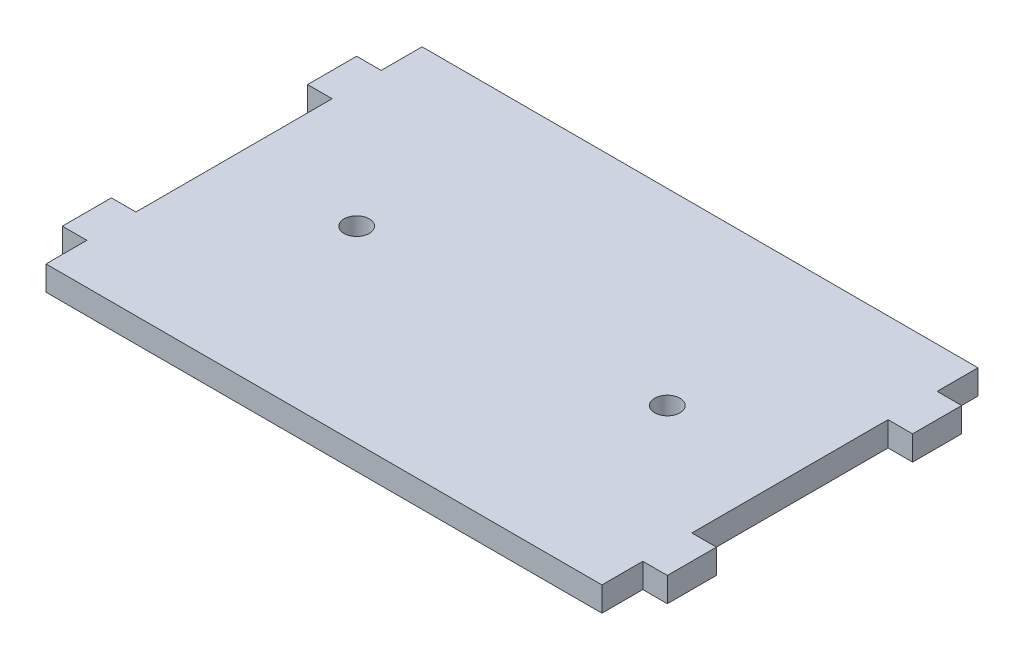
ISO-10303-21;
HEADER;
FILE_DESCRIPTION(('STEP AP214'),'2;1');
FILE_NAME('part.step','',(''),(''),'','','');
FILE_SCHEMA(('AUTOMOTIVE_DESIGN { 1 0 10303 214 1 1 1 1 }'));
ENDSEC;
DATA;
#1=APPLICATION_CONTEXT('core data for automotive mechanical design processes');
#2=APPLICATION_PROTOCOL_DEFINITION('international standard','automotive_design',2000,#1);
#3=PRODUCT_CONTEXT('',#1,'mechanical');
#4=PRODUCT('Part','Part','',(#3));
#5=PRODUCT_RELATED_PRODUCT_CATEGORY('part','',(#4));
#6=PRODUCT_DEFINITION_FORMATION('','',#4);
#7=PRODUCT_DEFINITION_CONTEXT('part definition',#1,'design');
#8=PRODUCT_DEFINITION('design','',#6,#7);
#9=PRODUCT_DEFINITION_SHAPE('','',#8);
#10=(LENGTH_UNIT() NAMED_UNIT(*) SI_UNIT(.MILLI.,.METRE.));
#11=(NAMED_UNIT(*) PLANE_ANGLE_UNIT() SI_UNIT($,.RADIAN.));
#12=(NAMED_UNIT(*) SI_UNIT($,.STERADIAN.) SOLID_ANGLE_UNIT());
#13=UNCERTAINTY_MEASURE_WITH_UNIT(LENGTH_MEASURE(1.E-05),#10,'distance_accuracy_value','');
#14=(GEOMETRIC_REPRESENTATION_CONTEXT(3) GLOBAL_UNCERTAINTY_ASSIGNED_CONTEXT((#13)) GLOBAL_UNIT_ASSIGNED_CONTEXT((#10,
#11,#12)) REPRESENTATION_CONTEXT('',''));
#15=CARTESIAN_POINT('',(0.,0.,0.));
#16=DIRECTION('',(0.,0.,1.));
#17=DIRECTION('',(1.,0.,0.));
#18=AXIS2_PLACEMENT_3D('',#15,#16,#17);
#19=CARTESIAN_POINT('',(0.,3.,0.));
#20=DIRECTION('',(0.,1.,0.));
#21=DIRECTION('',(0.,0.,1.));
#22=AXIS2_PLACEMENT_3D('',#19,#20,#21);
#23=PLANE('',#22);
#24=CARTESIAN_POINT('',(19.,3.,0.));
#25=DIRECTION('',(0.,1.,0.));
#26=DIRECTION('',(0.,0.,1.));
#27=AXIS2_PLACEMENT_3D('',#24,#25,#26);
#28=CIRCLE('',#27,1.55);
#29=CARTESIAN_POINT('',(19.,3.,1.55));
#30=VERTEX_POINT('',#29);
#31=EDGE_CURVE('E205',#30,#30,#28,.T.);
#32=ORIENTED_EDGE('',*,*,#31,.F.);
#33=EDGE_LOOP('',(#32));
#34=FACE_BOUND('',#33,.T.);
#35=DIRECTION('',(0.,0.,-1.));
#36=VECTOR('',#35,1.);
#37=CARTESIAN_POINT('',(34.,3.,-23.));
#38=LINE('',#37,#36);
#39=CARTESIAN_POINT('',(34.,3.,-18.));
#40=VERTEX_POINT('',#39);
#41=CARTESIAN_POINT('',(34.,3.,-23.));
#42=VERTEX_POINT('',#41);
#43=EDGE_CURVE('E240',#40,#42,#38,.T.);
#44=ORIENTED_EDGE('',*,*,#43,.T.);
#45=DIRECTION('',(-1.,0.,0.));
#46=VECTOR('',#45,1.);
#47=CARTESIAN_POINT('',(-34.,3.,-23.));
#48=LINE('',#47,#46);
#49=CARTESIAN_POINT('',(-34.,3.,-23.));
#50=VERTEX_POINT('',#49);
#51=EDGE_CURVE('E128',#42,#50,#48,.T.);
#52=ORIENTED_EDGE('',*,*,#51,.T.);
#53=DIRECTION('',(0.,0.,1.));
#54=VECTOR('',#53,1.);
#55=CARTESIAN_POINT('',(-34.,3.,-23.));
#56=LINE('',#55,#54);
#57=CARTESIAN_POINT('',(-34.,3.,-18.));
#58=VERTEX_POINT('',#57);
#59=EDGE_CURVE('E291',#50,#58,#56,.T.);
#60=ORIENTED_EDGE('',*,*,#59,.T.);
#61=DIRECTION('',(-1.,0.,0.));
#62=VECTOR('',#61,1.);
#63=CARTESIAN_POINT('',(-34.,3.,-18.));
#64=LINE('',#63,#62);
#65=CARTESIAN_POINT('',(-37.,3.,-18.));
#66=VERTEX_POINT('',#65);
#67=EDGE_CURVE('E310',#58,#66,#64,.T.);
#68=ORIENTED_EDGE('',*,*,#67,.T.);
#69=DIRECTION('',(0.,0.,1.));
#70=VECTOR('',#69,1.);
#71=CARTESIAN_POINT('',(-37.,3.,-18.));
#72=LINE('',#71,#70);
#73=CARTESIAN_POINT('',(-37.,3.,-12.));
#74=VERTEX_POINT('',#73);
#75=EDGE_CURVE('E307',#66,#74,#72,.T.);
#76=ORIENTED_EDGE('',*,*,#75,.T.);
#77=DIRECTION('',(1.,0.,0.));
#78=VECTOR('',#77,1.);
#79=CARTESIAN_POINT('',(-37.,3.,-12.));
#80=LINE('',#79,#78);
#81=CARTESIAN_POINT('',(-34.,3.,-12.));
#82=VERTEX_POINT('',#81);
#83=EDGE_CURVE('E309',#74,#82,#80,.T.);
#84=ORIENTED_EDGE('',*,*,#83,.T.);
#85=DIRECTION('',(0.,0.,1.));
#86=VECTOR('',#85,1.);
#87=CARTESIAN_POINT('',(-34.,3.,-12.));
#88=LINE('',#87,#86);
#89=CARTESIAN_POINT('',(-34.,3.,12.));
#90=VERTEX_POINT('',#89);
#91=EDGE_CURVE('E312',#82,#90,#88,.T.);
#92=ORIENTED_EDGE('',*,*,#91,.T.);
#93=DIRECTION('',(-1.,0.,0.));
#94=VECTOR('',#93,1.);
#95=CARTESIAN_POINT('',(-37.,3.,12.));
#96=LINE('',#95,#94);
#97=CARTESIAN_POINT('',(-37.,3.,12.));
#98=VERTEX_POINT('',#97);
#99=EDGE_CURVE('E318',#90,#98,#96,.T.);
#100=ORIENTED_EDGE('',*,*,#99,.T.);
#101=DIRECTION('',(0.,0.,1.));
#102=VECTOR('',#101,1.);
#103=CARTESIAN_POINT('',(-37.,3.,18.));
#104=LINE('',#103,#102);
#105=CARTESIAN_POINT('',(-37.,3.,18.));
#106=VERTEX_POINT('',#105);
#107=EDGE_CURVE('E320',#98,#106,#104,.T.);
#108=ORIENTED_EDGE('',*,*,#107,.T.);
#109=DIRECTION('',(1.,0.,0.));
#110=VECTOR('',#109,1.);
#111=CARTESIAN_POINT('',(-34.,3.,18.));
#112=LINE('',#111,#110);
#113=CARTESIAN_POINT('',(-34.,3.,18.));
#114=VERTEX_POINT('',#113);
#115=EDGE_CURVE('E322',#106,#114,#112,.T.);
#116=ORIENTED_EDGE('',*,*,#115,.T.);
#117=DIRECTION('',(0.,0.,1.));
#118=VECTOR('',#117,1.);
#119=CARTESIAN_POINT('',(-34.,3.,23.));
#120=LINE('',#119,#118);
#121=CARTESIAN_POINT('',(-34.,3.,23.));
#122=VERTEX_POINT('',#121);
#123=EDGE_CURVE('E324',#114,#122,#120,.T.);
#124=ORIENTED_EDGE('',*,*,#123,.T.);
#125=DIRECTION('',(1.,0.,0.));
#126=VECTOR('',#125,1.);
#127=CARTESIAN_POINT('',(-34.,3.,23.));
#128=LINE('',#127,#126);
#129=CARTESIAN_POINT('',(34.,3.,23.));
#130=VERTEX_POINT('',#129);
#131=EDGE_CURVE('E326',#122,#130,#128,.T.);
#132=ORIENTED_EDGE('',*,*,#131,.T.);
#133=DIRECTION('',(0.,0.,-1.));
#134=VECTOR('',#133,1.);
#135=CARTESIAN_POINT('',(34.,3.,23.));
#136=LINE('',#135,#134);
#137=CARTESIAN_POINT('',(34.,3.,18.));
#138=VERTEX_POINT('',#137);
#139=EDGE_CURVE('E328',#130,#138,#136,.T.);
#140=ORIENTED_EDGE('',*,*,#139,.T.);
#141=DIRECTION('',(1.,0.,0.));
#142=VECTOR('',#141,1.);
#143=CARTESIAN_POINT('',(34.,3.,18.));
#144=LINE('',#143,#142);
#145=CARTESIAN_POINT('',(37.,3.,18.));
#146=VERTEX_POINT('',#145);
#147=EDGE_CURVE('E330',#138,#146,#144,.T.);
#148=ORIENTED_EDGE('',*,*,#147,.T.);
#149=DIRECTION('',(0.,0.,-1.));
#150=VECTOR('',#149,1.);
#151=CARTESIAN_POINT('',(37.,3.,18.));
#152=LINE('',#151,#150);
#153=CARTESIAN_POINT('',(37.,3.,12.));
#154=VERTEX_POINT('',#153);
#155=EDGE_CURVE('E332',#146,#154,#152,.T.);
#156=ORIENTED_EDGE('',*,*,#155,.T.);
#157=DIRECTION('',(-1.,0.,0.));
#158=VECTOR('',#157,1.);
#159=CARTESIAN_POINT('',(37.,3.,12.));
#160=LINE('',#159,#158);
#161=CARTESIAN_POINT('',(34.,3.,12.));
#162=VERTEX_POINT('',#161);
#163=EDGE_CURVE('E334',#154,#162,#160,.T.);
#164=ORIENTED_EDGE('',*,*,#163,.T.);
#165=DIRECTION('',(0.,0.,-1.));
#166=VECTOR('',#165,1.);
#167=CARTESIAN_POINT('',(34.,3.,-12.));
#168=LINE('',#167,#166);
#169=CARTESIAN_POINT('',(34.,3.,-12.));
#170=VERTEX_POINT('',#169);
#171=EDGE_CURVE('E183',#162,#170,#168,.T.);
#172=ORIENTED_EDGE('',*,*,#171,.T.);
#173=DIRECTION('',(1.,0.,0.));
#174=VECTOR('',#173,1.);
#175=CARTESIAN_POINT('',(37.,3.,-12.));
#176=LINE('',#175,#174);
#177=CARTESIAN_POINT('',(37.,3.,-12.));
#178=VERTEX_POINT('',#177);
#179=EDGE_CURVE('E177',#170,#178,#176,.T.);
#180=ORIENTED_EDGE('',*,*,#179,.T.);
#181=DIRECTION('',(0.,0.,-1.));
#182=VECTOR('',#181,1.);
#183=CARTESIAN_POINT('',(37.,3.,-18.));
#184=LINE('',#183,#182);
#185=CARTESIAN_POINT('',(37.,3.,-18.));
#186=VERTEX_POINT('',#185);
#187=EDGE_CURVE('E181',#178,#186,#184,.T.);
#188=ORIENTED_EDGE('',*,*,#187,.T.);
#189=DIRECTION('',(-1.,0.,0.));
#190=VECTOR('',#189,1.);
#191=CARTESIAN_POINT('',(34.,3.,-18.));
#192=LINE('',#191,#190);
#193=EDGE_CURVE('E49',#186,#40,#192,.T.);
#194=ORIENTED_EDGE('',*,*,#193,.T.);
#195=EDGE_LOOP('',(#44,#52,#60,#68,#76,#84,#92,#100,#108,#116,#124,#132,#140,#148,#156,#164,
#172,#180,#188,#194));
#196=FACE_BOUND('',#195,.T.);
#197=CARTESIAN_POINT('',(-19.,3.,0.));
#198=DIRECTION('',(0.,1.,0.));
#199=DIRECTION('',(0.,0.,-1.));
#200=AXIS2_PLACEMENT_3D('',#197,#198,#199);
#201=CIRCLE('',#200,1.55);
#202=CARTESIAN_POINT('',(-19.,3.,-1.55));
#203=VERTEX_POINT('',#202);
#204=EDGE_CURVE('E376',#203,#203,#201,.T.);
#205=ORIENTED_EDGE('',*,*,#204,.F.);
#206=EDGE_LOOP('',(#205));
#207=FACE_BOUND('',#206,.T.);
#208=ADVANCED_FACE('F32',(#34,#196,#207),#23,.T.);
#209=CARTESIAN_POINT('',(0.,0.,0.));
#210=DIRECTION('',(0.,1.,0.));
#211=DIRECTION('',(0.,0.,1.));
#212=AXIS2_PLACEMENT_3D('',#209,#210,#211);
#213=PLANE('',#212);
#214=DIRECTION('',(0.,0.,-1.));
#215=VECTOR('',#214,1.);
#216=CARTESIAN_POINT('',(34.,0.,-23.));
#217=LINE('',#216,#215);
#218=CARTESIAN_POINT('',(34.,0.,-18.));
#219=VERTEX_POINT('',#218);
#220=CARTESIAN_POINT('',(34.,0.,-23.));
#221=VERTEX_POINT('',#220);
#222=EDGE_CURVE('E201',#219,#221,#217,.T.);
#223=ORIENTED_EDGE('',*,*,#222,.F.);
#224=DIRECTION('',(-1.,0.,0.));
#225=VECTOR('',#224,1.);
#226=CARTESIAN_POINT('',(34.,0.,-18.));
#227=LINE('',#226,#225);
#228=CARTESIAN_POINT('',(37.,0.,-18.));
#229=VERTEX_POINT('',#228);
#230=EDGE_CURVE('E120',#229,#219,#227,.T.);
#231=ORIENTED_EDGE('',*,*,#230,.F.);
#232=DIRECTION('',(0.,0.,-1.));
#233=VECTOR('',#232,1.);
#234=CARTESIAN_POINT('',(37.,0.,-18.));
#235=LINE('',#234,#233);
#236=CARTESIAN_POINT('',(37.,0.,-12.));
#237=VERTEX_POINT('',#236);
#238=EDGE_CURVE('E114',#237,#229,#235,.T.);
#239=ORIENTED_EDGE('',*,*,#238,.F.);
#240=DIRECTION('',(1.,0.,0.));
#241=VECTOR('',#240,1.);
#242=CARTESIAN_POINT('',(37.,0.,-12.));
#243=LINE('',#242,#241);
#244=CARTESIAN_POINT('',(34.,0.,-12.));
#245=VERTEX_POINT('',#244);
#246=EDGE_CURVE('E191',#245,#237,#243,.T.);
#247=ORIENTED_EDGE('',*,*,#246,.F.);
#248=DIRECTION('',(0.,0.,-1.));
#249=VECTOR('',#248,1.);
#250=CARTESIAN_POINT('',(34.,0.,-12.));
#251=LINE('',#250,#249);
#252=CARTESIAN_POINT('',(34.,0.,12.));
#253=VERTEX_POINT('',#252);
#254=EDGE_CURVE('E235',#253,#245,#251,.T.);
#255=ORIENTED_EDGE('',*,*,#254,.F.);
#256=DIRECTION('',(-1.,0.,0.));
#257=VECTOR('',#256,1.);
#258=CARTESIAN_POINT('',(37.,0.,12.));
#259=LINE('',#258,#257);
#260=CARTESIAN_POINT('',(37.,0.,12.));
#261=VERTEX_POINT('',#260);
#262=EDGE_CURVE('E233',#261,#253,#259,.T.);
#263=ORIENTED_EDGE('',*,*,#262,.F.);
#264=DIRECTION('',(0.,0.,-1.));
#265=VECTOR('',#264,1.);
#266=CARTESIAN_POINT('',(37.,0.,18.));
#267=LINE('',#266,#265);
#268=CARTESIAN_POINT('',(37.,0.,18.));
#269=VERTEX_POINT('',#268);
#270=EDGE_CURVE('E231',#269,#261,#267,.T.);
#271=ORIENTED_EDGE('',*,*,#270,.F.);
#272=DIRECTION('',(1.,0.,0.));
#273=VECTOR('',#272,1.);
#274=CARTESIAN_POINT('',(34.,0.,18.));
#275=LINE('',#274,#273);
#276=CARTESIAN_POINT('',(34.,0.,18.));
#277=VERTEX_POINT('',#276);
#278=EDGE_CURVE('E229',#277,#269,#275,.T.);
#279=ORIENTED_EDGE('',*,*,#278,.F.);
#280=DIRECTION('',(0.,0.,-1.));
#281=VECTOR('',#280,1.);
#282=CARTESIAN_POINT('',(34.,0.,23.));
#283=LINE('',#282,#281);
#284=CARTESIAN_POINT('',(34.,0.,23.));
#285=VERTEX_POINT('',#284);
#286=EDGE_CURVE('E227',#285,#277,#283,.T.);
#287=ORIENTED_EDGE('',*,*,#286,.F.);
#288=DIRECTION('',(1.,0.,0.));
#289=VECTOR('',#288,1.);
#290=CARTESIAN_POINT('',(-34.,0.,23.));
#291=LINE('',#290,#289);
#292=CARTESIAN_POINT('',(-34.,0.,23.));
#293=VERTEX_POINT('',#292);
#294=EDGE_CURVE('E225',#293,#285,#291,.T.);
#295=ORIENTED_EDGE('',*,*,#294,.F.);
#296=DIRECTION('',(0.,0.,1.));
#297=VECTOR('',#296,1.);
#298=CARTESIAN_POINT('',(-34.,0.,23.));
#299=LINE('',#298,#297);
#300=CARTESIAN_POINT('',(-34.,0.,18.));
#301=VERTEX_POINT('',#300);
#302=EDGE_CURVE('E223',#301,#293,#299,.T.);
#303=ORIENTED_EDGE('',*,*,#302,.F.);
#304=DIRECTION('',(1.,0.,0.));
#305=VECTOR('',#304,1.);
#306=CARTESIAN_POINT('',(-34.,0.,18.));
#307=LINE('',#306,#305);
#308=CARTESIAN_POINT('',(-37.,0.,18.));
#309=VERTEX_POINT('',#308);
#310=EDGE_CURVE('E221',#309,#301,#307,.T.);
#311=ORIENTED_EDGE('',*,*,#310,.F.);
#312=DIRECTION('',(0.,0.,1.));
#313=VECTOR('',#312,1.);
#314=CARTESIAN_POINT('',(-37.,0.,18.));
#315=LINE('',#314,#313);
#316=CARTESIAN_POINT('',(-37.,0.,12.));
#317=VERTEX_POINT('',#316);
#318=EDGE_CURVE('E219',#317,#309,#315,.T.);
#319=ORIENTED_EDGE('',*,*,#318,.F.);
#320=DIRECTION('',(-1.,0.,0.));
#321=VECTOR('',#320,1.);
#322=CARTESIAN_POINT('',(-37.,0.,12.));
#323=LINE('',#322,#321);
#324=CARTESIAN_POINT('',(-34.,0.,12.));
#325=VERTEX_POINT('',#324);
#326=EDGE_CURVE('E217',#325,#317,#323,.T.);
#327=ORIENTED_EDGE('',*,*,#326,.F.);
#328=DIRECTION('',(0.,0.,1.));
#329=VECTOR('',#328,1.);
#330=CARTESIAN_POINT('',(-34.,0.,-12.));
#331=LINE('',#330,#329);
#332=CARTESIAN_POINT('',(-34.,0.,-12.));
#333=VERTEX_POINT('',#332);
#334=EDGE_CURVE('E215',#333,#325,#331,.T.);
#335=ORIENTED_EDGE('',*,*,#334,.F.);
#336=DIRECTION('',(1.,0.,0.));
#337=VECTOR('',#336,1.);
#338=CARTESIAN_POINT('',(-37.,0.,-12.));
#339=LINE('',#338,#337);
#340=CARTESIAN_POINT('',(-37.,0.,-12.));
#341=VERTEX_POINT('',#340);
#342=EDGE_CURVE('E213',#341,#333,#339,.T.);
#343=ORIENTED_EDGE('',*,*,#342,.F.);
#344=DIRECTION('',(0.,0.,1.));
#345=VECTOR('',#344,1.);
#346=CARTESIAN_POINT('',(-37.,0.,-18.));
#347=LINE('',#346,#345);
#348=CARTESIAN_POINT('',(-37.,0.,-18.));
#349=VERTEX_POINT('',#348);
#350=EDGE_CURVE('E211',#349,#341,#347,.T.);
#351=ORIENTED_EDGE('',*,*,#350,.F.);
#352=DIRECTION('',(-1.,0.,0.));
#353=VECTOR('',#352,1.);
#354=CARTESIAN_POINT('',(-34.,0.,-18.));
#355=LINE('',#354,#353);
#356=CARTESIAN_POINT('',(-34.,0.,-18.));
#357=VERTEX_POINT('',#356);
#358=EDGE_CURVE('E209',#357,#349,#355,.T.);
#359=ORIENTED_EDGE('',*,*,#358,.F.);
#360=DIRECTION('',(0.,0.,1.));
#361=VECTOR('',#360,1.);
#362=CARTESIAN_POINT('',(-34.,0.,-23.));
#363=LINE('',#362,#361);
#364=CARTESIAN_POINT('',(-34.,0.,-23.));
#365=VERTEX_POINT('',#364);
#366=EDGE_CURVE('E207',#365,#357,#363,.T.);
#367=ORIENTED_EDGE('',*,*,#366,.F.);
#368=DIRECTION('',(-1.,0.,0.));
#369=VECTOR('',#368,1.);
#370=CARTESIAN_POINT('',(-34.,0.,-23.));
#371=LINE('',#370,#369);
#372=EDGE_CURVE('E204',#221,#365,#371,.T.);
#373=ORIENTED_EDGE('',*,*,#372,.F.);
#374=EDGE_LOOP('',(#223,#231,#239,#247,#255,#263,#271,#279,#287,#295,#303,#311,#319,#327,#335,
#343,#351,#359,#367,#373));
#375=FACE_BOUND('',#374,.T.);
#376=CARTESIAN_POINT('',(19.,0.,0.));
#377=DIRECTION('',(0.,1.,0.));
#378=DIRECTION('',(0.,0.,1.));
#379=AXIS2_PLACEMENT_3D('',#376,#377,#378);
#380=CIRCLE('',#379,1.55);
#381=CARTESIAN_POINT('',(19.,0.,1.55));
#382=VERTEX_POINT('',#381);
#383=EDGE_CURVE('E382',#382,#382,#380,.T.);
#384=ORIENTED_EDGE('',*,*,#383,.T.);
#385=EDGE_LOOP('',(#384));
#386=FACE_BOUND('',#385,.T.);
#387=CARTESIAN_POINT('',(-19.,0.,0.));
#388=DIRECTION('',(0.,1.,0.));
#389=DIRECTION('',(0.,0.,-1.));
#390=AXIS2_PLACEMENT_3D('',#387,#388,#389);
#391=CIRCLE('',#390,1.55);
#392=CARTESIAN_POINT('',(-19.,0.,-1.55));
#393=VERTEX_POINT('',#392);
#394=EDGE_CURVE('E379',#393,#393,#391,.T.);
#395=ORIENTED_EDGE('',*,*,#394,.T.);
#396=EDGE_LOOP('',(#395));
#397=FACE_BOUND('',#396,.T.);
#398=ADVANCED_FACE('F295',(#375,#386,#397),#213,.F.);
#399=CARTESIAN_POINT('',(34.,3.,-23.));
#400=DIRECTION('',(-1.,0.,0.));
#401=DIRECTION('',(0.,0.,1.));
#402=AXIS2_PLACEMENT_3D('',#399,#400,#401);
#403=PLANE('',#402);
#404=ORIENTED_EDGE('',*,*,#222,.T.);
#405=DIRECTION('',(0.,-1.,0.));
#406=VECTOR('',#405,1.);
#407=CARTESIAN_POINT('',(34.,3.,-23.));
#408=LINE('',#407,#406);
#409=EDGE_CURVE('E11',#42,#221,#408,.T.);
#410=ORIENTED_EDGE('',*,*,#409,.F.);
#411=ORIENTED_EDGE('',*,*,#43,.F.);
#412=DIRECTION('',(0.,-1.,0.));
#413=VECTOR('',#412,1.);
#414=CARTESIAN_POINT('',(34.,3.,-18.));
#415=LINE('',#414,#413);
#416=EDGE_CURVE('E197',#40,#219,#415,.T.);
#417=ORIENTED_EDGE('',*,*,#416,.T.);
#418=EDGE_LOOP('',(#404,#410,#411,#417));
#419=FACE_BOUND('',#418,.T.);
#420=ADVANCED_FACE('F34',(#419),#403,.F.);
#421=CARTESIAN_POINT('',(-34.,3.,-23.));
#422=DIRECTION('',(0.,0.,1.));
#423=DIRECTION('',(1.,0.,0.));
#424=AXIS2_PLACEMENT_3D('',#421,#422,#423);
#425=PLANE('',#424);
#426=ORIENTED_EDGE('',*,*,#372,.T.);
#427=DIRECTION('',(0.,-1.,0.));
#428=VECTOR('',#427,1.);
#429=CARTESIAN_POINT('',(-34.,3.,-23.));
#430=LINE('',#429,#428);
#431=EDGE_CURVE('E41',#50,#365,#430,.T.);
#432=ORIENTED_EDGE('',*,*,#431,.F.);
#433=ORIENTED_EDGE('',*,*,#51,.F.);
#434=ORIENTED_EDGE('',*,*,#409,.T.);
#435=EDGE_LOOP('',(#426,#432,#433,#434));
#436=FACE_BOUND('',#435,.T.);
#437=ADVANCED_FACE('F555',(#436),#425,.F.);
#438=CARTESIAN_POINT('',(-34.,3.,-23.));
#439=DIRECTION('',(1.,0.,0.));
#440=DIRECTION('',(0.,0.,-1.));
#441=AXIS2_PLACEMENT_3D('',#438,#439,#440);
#442=PLANE('',#441);
#443=ORIENTED_EDGE('',*,*,#366,.T.);
#444=DIRECTION('',(0.,-1.,0.));
#445=VECTOR('',#444,1.);
#446=CARTESIAN_POINT('',(-34.,3.,-18.));
#447=LINE('',#446,#445);
#448=EDGE_CURVE('E283',#58,#357,#447,.T.);
#449=ORIENTED_EDGE('',*,*,#448,.F.);
#450=ORIENTED_EDGE('',*,*,#59,.F.);
#451=ORIENTED_EDGE('',*,*,#431,.T.);
#452=EDGE_LOOP('',(#443,#449,#450,#451));
#453=FACE_BOUND('',#452,.T.);
#454=ADVANCED_FACE('F289',(#453),#442,.F.);
#455=CARTESIAN_POINT('',(-34.,3.,-18.));
#456=DIRECTION('',(0.,0.,1.));
#457=DIRECTION('',(1.,0.,0.));
#458=AXIS2_PLACEMENT_3D('',#455,#456,#457);
#459=PLANE('',#458);
#460=ORIENTED_EDGE('',*,*,#358,.T.);
#461=DIRECTION('',(0.,-1.,0.));
#462=VECTOR('',#461,1.);
#463=CARTESIAN_POINT('',(-37.,3.,-18.));
#464=LINE('',#463,#462);
#465=EDGE_CURVE('E280',#66,#349,#464,.T.);
#466=ORIENTED_EDGE('',*,*,#465,.F.);
#467=ORIENTED_EDGE('',*,*,#67,.F.);
#468=ORIENTED_EDGE('',*,*,#448,.T.);
#469=EDGE_LOOP('',(#460,#466,#467,#468));
#470=FACE_BOUND('',#469,.T.);
#471=ADVANCED_FACE('F301',(#470),#459,.F.);
#472=CARTESIAN_POINT('',(-37.,3.,-18.));
#473=DIRECTION('',(1.,0.,0.));
#474=DIRECTION('',(0.,0.,-1.));
#475=AXIS2_PLACEMENT_3D('',#472,#473,#474);
#476=PLANE('',#475);
#477=ORIENTED_EDGE('',*,*,#350,.T.);
#478=DIRECTION('',(0.,-1.,0.));
#479=VECTOR('',#478,1.);
#480=CARTESIAN_POINT('',(-37.,3.,-12.));
#481=LINE('',#480,#479);
#482=EDGE_CURVE('E277',#74,#341,#481,.T.);
#483=ORIENTED_EDGE('',*,*,#482,.F.);
#484=ORIENTED_EDGE('',*,*,#75,.F.);
#485=ORIENTED_EDGE('',*,*,#465,.T.);
#486=EDGE_LOOP('',(#477,#483,#484,#485));
#487=FACE_BOUND('',#486,.T.);
#488=ADVANCED_FACE('F305',(#487),#476,.F.);
#489=CARTESIAN_POINT('',(-37.,3.,-12.));
#490=DIRECTION('',(0.,0.,-1.));
#491=DIRECTION('',(-1.,0.,0.));
#492=AXIS2_PLACEMENT_3D('',#489,#490,#491);
#493=PLANE('',#492);
#494=ORIENTED_EDGE('',*,*,#342,.T.);
#495=DIRECTION('',(0.,-1.,0.));
#496=VECTOR('',#495,1.);
#497=CARTESIAN_POINT('',(-34.,3.,-12.));
#498=LINE('',#497,#496);
#499=EDGE_CURVE('E274',#82,#333,#498,.T.);
#500=ORIENTED_EDGE('',*,*,#499,.F.);
#501=ORIENTED_EDGE('',*,*,#83,.F.);
#502=ORIENTED_EDGE('',*,*,#482,.T.);
#503=EDGE_LOOP('',(#494,#500,#501,#502));
#504=FACE_BOUND('',#503,.T.);
#505=ADVANCED_FACE('F520',(#504),#493,.F.);
#506=CARTESIAN_POINT('',(-34.,3.,-12.));
#507=DIRECTION('',(1.,0.,0.));
#508=DIRECTION('',(0.,0.,-1.));
#509=AXIS2_PLACEMENT_3D('',#506,#507,#508);
#510=PLANE('',#509);
#511=ORIENTED_EDGE('',*,*,#334,.T.);
#512=DIRECTION('',(0.,-1.,0.));
#513=VECTOR('',#512,1.);
#514=CARTESIAN_POINT('',(-34.,3.,12.));
#515=LINE('',#514,#513);
#516=EDGE_CURVE('E271',#90,#325,#515,.T.);
#517=ORIENTED_EDGE('',*,*,#516,.F.);
#518=ORIENTED_EDGE('',*,*,#91,.F.);
#519=ORIENTED_EDGE('',*,*,#499,.T.);
#520=EDGE_LOOP('',(#511,#517,#518,#519));
#521=FACE_BOUND('',#520,.T.);
#522=ADVANCED_FACE('F510',(#521),#510,.F.);
#523=CARTESIAN_POINT('',(-37.,3.,12.));
#524=DIRECTION('',(0.,0.,1.));
#525=DIRECTION('',(1.,0.,0.));
#526=AXIS2_PLACEMENT_3D('',#523,#524,#525);
#527=PLANE('',#526);
#528=ORIENTED_EDGE('',*,*,#326,.T.);
#529=DIRECTION('',(0.,-1.,0.));
#530=VECTOR('',#529,1.);
#531=CARTESIAN_POINT('',(-37.,3.,12.));
#532=LINE('',#531,#530);
#533=EDGE_CURVE('E268',#98,#317,#532,.T.);
#534=ORIENTED_EDGE('',*,*,#533,.F.);
#535=ORIENTED_EDGE('',*,*,#99,.F.);
#536=ORIENTED_EDGE('',*,*,#516,.T.);
#537=EDGE_LOOP('',(#528,#534,#535,#536));
#538=FACE_BOUND('',#537,.T.);
#539=ADVANCED_FACE('F500',(#538),#527,.F.);
#540=CARTESIAN_POINT('',(-37.,3.,18.));
#541=DIRECTION('',(1.,0.,0.));
#542=DIRECTION('',(0.,0.,-1.));
#543=AXIS2_PLACEMENT_3D('',#540,#541,#542);
#544=PLANE('',#543);
#545=ORIENTED_EDGE('',*,*,#318,.T.);
#546=DIRECTION('',(0.,-1.,0.));
#547=VECTOR('',#546,1.);
#548=CARTESIAN_POINT('',(-37.,3.,18.));
#549=LINE('',#548,#547);
#550=EDGE_CURVE('E265',#106,#309,#549,.T.);
#551=ORIENTED_EDGE('',*,*,#550,.F.);
#552=ORIENTED_EDGE('',*,*,#107,.F.);
#553=ORIENTED_EDGE('',*,*,#533,.T.);
#554=EDGE_LOOP('',(#545,#551,#552,#553));
#555=FACE_BOUND('',#554,.T.);
#556=ADVANCED_FACE('F490',(#555),#544,.F.);
#557=CARTESIAN_POINT('',(-34.,3.,18.));
#558=DIRECTION('',(0.,0.,-1.));
#559=DIRECTION('',(-1.,0.,0.));
#560=AXIS2_PLACEMENT_3D('',#557,#558,#559);
#561=PLANE('',#560);
#562=ORIENTED_EDGE('',*,*,#310,.T.);
#563=DIRECTION('',(0.,-1.,0.));
#564=VECTOR('',#563,1.);
#565=CARTESIAN_POINT('',(-34.,3.,18.));
#566=LINE('',#565,#564);
#567=EDGE_CURVE('E262',#114,#301,#566,.T.);
#568=ORIENTED_EDGE('',*,*,#567,.F.);
#569=ORIENTED_EDGE('',*,*,#115,.F.);
#570=ORIENTED_EDGE('',*,*,#550,.T.);
#571=EDGE_LOOP('',(#562,#568,#569,#570));
#572=FACE_BOUND('',#571,.T.);
#573=ADVANCED_FACE('F480',(#572),#561,.F.);
#574=CARTESIAN_POINT('',(-34.,3.,23.));
#575=DIRECTION('',(1.,0.,0.));
#576=DIRECTION('',(0.,0.,-1.));
#577=AXIS2_PLACEMENT_3D('',#574,#575,#576);
#578=PLANE('',#577);
#579=ORIENTED_EDGE('',*,*,#302,.T.);
#580=DIRECTION('',(0.,-1.,0.));
#581=VECTOR('',#580,1.);
#582=CARTESIAN_POINT('',(-34.,3.,23.));
#583=LINE('',#582,#581);
#584=EDGE_CURVE('E259',#122,#293,#583,.T.);
#585=ORIENTED_EDGE('',*,*,#584,.F.);
#586=ORIENTED_EDGE('',*,*,#123,.F.);
#587=ORIENTED_EDGE('',*,*,#567,.T.);
#588=EDGE_LOOP('',(#579,#585,#586,#587));
#589=FACE_BOUND('',#588,.T.);
#590=ADVANCED_FACE('F470',(#589),#578,.F.);
#591=CARTESIAN_POINT('',(-34.,3.,23.));
#592=DIRECTION('',(0.,0.,-1.));
#593=DIRECTION('',(-1.,0.,0.));
#594=AXIS2_PLACEMENT_3D('',#591,#592,#593);
#595=PLANE('',#594);
#596=ORIENTED_EDGE('',*,*,#294,.T.);
#597=DIRECTION('',(0.,-1.,0.));
#598=VECTOR('',#597,1.);
#599=CARTESIAN_POINT('',(34.,3.,23.));
#600=LINE('',#599,#598);
#601=EDGE_CURVE('E256',#130,#285,#600,.T.);
#602=ORIENTED_EDGE('',*,*,#601,.F.);
#603=ORIENTED_EDGE('',*,*,#131,.F.);
#604=ORIENTED_EDGE('',*,*,#584,.T.);
#605=EDGE_LOOP('',(#596,#602,#603,#604));
#606=FACE_BOUND('',#605,.T.);
#607=ADVANCED_FACE('F460',(#606),#595,.F.);
#608=CARTESIAN_POINT('',(34.,3.,23.));
#609=DIRECTION('',(-1.,0.,0.));
#610=DIRECTION('',(0.,0.,1.));
#611=AXIS2_PLACEMENT_3D('',#608,#609,#610);
#612=PLANE('',#611);
#613=ORIENTED_EDGE('',*,*,#286,.T.);
#614=DIRECTION('',(0.,-1.,0.));
#615=VECTOR('',#614,1.);
#616=CARTESIAN_POINT('',(34.,3.,18.));
#617=LINE('',#616,#615);
#618=EDGE_CURVE('E253',#138,#277,#617,.T.);
#619=ORIENTED_EDGE('',*,*,#618,.F.);
#620=ORIENTED_EDGE('',*,*,#139,.F.);
#621=ORIENTED_EDGE('',*,*,#601,.T.);
#622=EDGE_LOOP('',(#613,#619,#620,#621));
#623=FACE_BOUND('',#622,.T.);
#624=ADVANCED_FACE('F450',(#623),#612,.F.);
#625=CARTESIAN_POINT('',(34.,3.,18.));
#626=DIRECTION('',(0.,0.,-1.));
#627=DIRECTION('',(-1.,0.,0.));
#628=AXIS2_PLACEMENT_3D('',#625,#626,#627);
#629=PLANE('',#628);
#630=ORIENTED_EDGE('',*,*,#278,.T.);
#631=DIRECTION('',(0.,-1.,0.));
#632=VECTOR('',#631,1.);
#633=CARTESIAN_POINT('',(37.,3.,18.));
#634=LINE('',#633,#632);
#635=EDGE_CURVE('E250',#146,#269,#634,.T.);
#636=ORIENTED_EDGE('',*,*,#635,.F.);
#637=ORIENTED_EDGE('',*,*,#147,.F.);
#638=ORIENTED_EDGE('',*,*,#618,.T.);
#639=EDGE_LOOP('',(#630,#636,#637,#638));
#640=FACE_BOUND('',#639,.T.);
#641=ADVANCED_FACE('F440',(#640),#629,.F.);
#642=CARTESIAN_POINT('',(37.,3.,18.));
#643=DIRECTION('',(-1.,0.,0.));
#644=DIRECTION('',(0.,0.,1.));
#645=AXIS2_PLACEMENT_3D('',#642,#643,#644);
#646=PLANE('',#645);
#647=ORIENTED_EDGE('',*,*,#270,.T.);
#648=DIRECTION('',(0.,-1.,0.));
#649=VECTOR('',#648,1.);
#650=CARTESIAN_POINT('',(37.,3.,12.));
#651=LINE('',#650,#649);
#652=EDGE_CURVE('E247',#154,#261,#651,.T.);
#653=ORIENTED_EDGE('',*,*,#652,.F.);
#654=ORIENTED_EDGE('',*,*,#155,.F.);
#655=ORIENTED_EDGE('',*,*,#635,.T.);
#656=EDGE_LOOP('',(#647,#653,#654,#655));
#657=FACE_BOUND('',#656,.T.);
#658=ADVANCED_FACE('F431',(#657),#646,.F.);
#659=CARTESIAN_POINT('',(37.,3.,12.));
#660=DIRECTION('',(0.,0.,1.));
#661=DIRECTION('',(1.,0.,0.));
#662=AXIS2_PLACEMENT_3D('',#659,#660,#661);
#663=PLANE('',#662);
#664=ORIENTED_EDGE('',*,*,#262,.T.);
#665=DIRECTION('',(0.,-1.,0.));
#666=VECTOR('',#665,1.);
#667=CARTESIAN_POINT('',(34.,3.,12.));
#668=LINE('',#667,#666);
#669=EDGE_CURVE('E244',#162,#253,#668,.T.);
#670=ORIENTED_EDGE('',*,*,#669,.F.);
#671=ORIENTED_EDGE('',*,*,#163,.F.);
#672=ORIENTED_EDGE('',*,*,#652,.T.);
#673=EDGE_LOOP('',(#664,#670,#671,#672));
#674=FACE_BOUND('',#673,.T.);
#675=ADVANCED_FACE('F340',(#674),#663,.F.);
#676=CARTESIAN_POINT('',(34.,3.,-12.));
#677=DIRECTION('',(-1.,0.,0.));
#678=DIRECTION('',(0.,0.,1.));
#679=AXIS2_PLACEMENT_3D('',#676,#677,#678);
#680=PLANE('',#679);
#681=ORIENTED_EDGE('',*,*,#254,.T.);
#682=DIRECTION('',(0.,-1.,0.));
#683=VECTOR('',#682,1.);
#684=CARTESIAN_POINT('',(34.,3.,-12.));
#685=LINE('',#684,#683);
#686=EDGE_CURVE('E192',#170,#245,#685,.T.);
#687=ORIENTED_EDGE('',*,*,#686,.F.);
#688=ORIENTED_EDGE('',*,*,#171,.F.);
#689=ORIENTED_EDGE('',*,*,#669,.T.);
#690=EDGE_LOOP('',(#681,#687,#688,#689));
#691=FACE_BOUND('',#690,.T.);
#692=ADVANCED_FACE('F344',(#691),#680,.F.);
#693=CARTESIAN_POINT('',(37.,3.,-12.));
#694=DIRECTION('',(0.,0.,-1.));
#695=DIRECTION('',(-1.,0.,0.));
#696=AXIS2_PLACEMENT_3D('',#693,#694,#695);
#697=PLANE('',#696);
#698=ORIENTED_EDGE('',*,*,#246,.T.);
#699=DIRECTION('',(0.,-1.,0.));
#700=VECTOR('',#699,1.);
#701=CARTESIAN_POINT('',(37.,3.,-12.));
#702=LINE('',#701,#700);
#703=EDGE_CURVE('E188',#178,#237,#702,.T.);
#704=ORIENTED_EDGE('',*,*,#703,.F.);
#705=ORIENTED_EDGE('',*,*,#179,.F.);
#706=ORIENTED_EDGE('',*,*,#686,.T.);
#707=EDGE_LOOP('',(#698,#704,#705,#706));
#708=FACE_BOUND('',#707,.T.);
#709=ADVANCED_FACE('F189',(#708),#697,.F.);
#710=CARTESIAN_POINT('',(37.,3.,-18.));
#711=DIRECTION('',(-1.,0.,0.));
#712=DIRECTION('',(0.,0.,1.));
#713=AXIS2_PLACEMENT_3D('',#710,#711,#712);
#714=PLANE('',#713);
#715=ORIENTED_EDGE('',*,*,#238,.T.);
#716=DIRECTION('',(0.,-1.,0.));
#717=VECTOR('',#716,1.);
#718=CARTESIAN_POINT('',(37.,3.,-18.));
#719=LINE('',#718,#717);
#720=EDGE_CURVE('E193',#186,#229,#719,.T.);
#721=ORIENTED_EDGE('',*,*,#720,.F.);
#722=ORIENTED_EDGE('',*,*,#187,.F.);
#723=ORIENTED_EDGE('',*,*,#703,.T.);
#724=EDGE_LOOP('',(#715,#721,#722,#723));
#725=FACE_BOUND('',#724,.T.);
#726=ADVANCED_FACE('F195',(#725),#714,.F.);
#727=CARTESIAN_POINT('',(34.,3.,-18.));
#728=DIRECTION('',(0.,0.,1.));
#729=DIRECTION('',(1.,0.,0.));
#730=AXIS2_PLACEMENT_3D('',#727,#728,#729);
#731=PLANE('',#730);
#732=ORIENTED_EDGE('',*,*,#230,.T.);
#733=ORIENTED_EDGE('',*,*,#416,.F.);
#734=ORIENTED_EDGE('',*,*,#193,.F.);
#735=ORIENTED_EDGE('',*,*,#720,.T.);
#736=EDGE_LOOP('',(#732,#733,#734,#735));
#737=FACE_BOUND('',#736,.T.);
#738=ADVANCED_FACE('F348',(#737),#731,.F.);
#739=CARTESIAN_POINT('',(19.,3.,0.));
#740=DIRECTION('',(0.,-1.,0.));
#741=DIRECTION('',(0.,0.,-1.));
#742=AXIS2_PLACEMENT_3D('',#739,#740,#741);
#743=CYLINDRICAL_SURFACE('',#742,1.55);
#744=ORIENTED_EDGE('',*,*,#31,.T.);
#745=EDGE_LOOP('',(#744));
#746=FACE_BOUND('',#745,.T.);
#747=ORIENTED_EDGE('',*,*,#383,.F.);
#748=EDGE_LOOP('',(#747));
#749=FACE_BOUND('',#748,.T.);
#750=ADVANCED_FACE('F350',(#746,#749),#743,.F.);
#751=CARTESIAN_POINT('',(-19.,3.,0.));
#752=DIRECTION('',(0.,-1.,0.));
#753=DIRECTION('',(0.,0.,-1.));
#754=AXIS2_PLACEMENT_3D('',#751,#752,#753);
#755=CYLINDRICAL_SURFACE('',#754,1.55);
#756=ORIENTED_EDGE('',*,*,#204,.T.);
#757=EDGE_LOOP('',(#756));
#758=FACE_BOUND('',#757,.T.);
#759=ORIENTED_EDGE('',*,*,#394,.F.);
#760=EDGE_LOOP('',(#759));
#761=FACE_BOUND('',#760,.T.);
#762=ADVANCED_FACE('F356',(#758,#761),#755,.F.);
#763=CLOSED_SHELL('',(#208,#398,#420,#437,#454,#471,#488,#505,#522,#539,#556,#573,#590,#607,
#624,#641,#658,#675,#692,#709,#726,#738,#750,#762));
#764=MANIFOLD_SOLID_BREP('B2',#763);
#765=ADVANCED_BREP_SHAPE_REPRESENTATION('',(#18,#764),#14);
#766=SHAPE_DEFINITION_REPRESENTATION(#9,#765);
ENDSEC;
END-ISO-10303-21;
